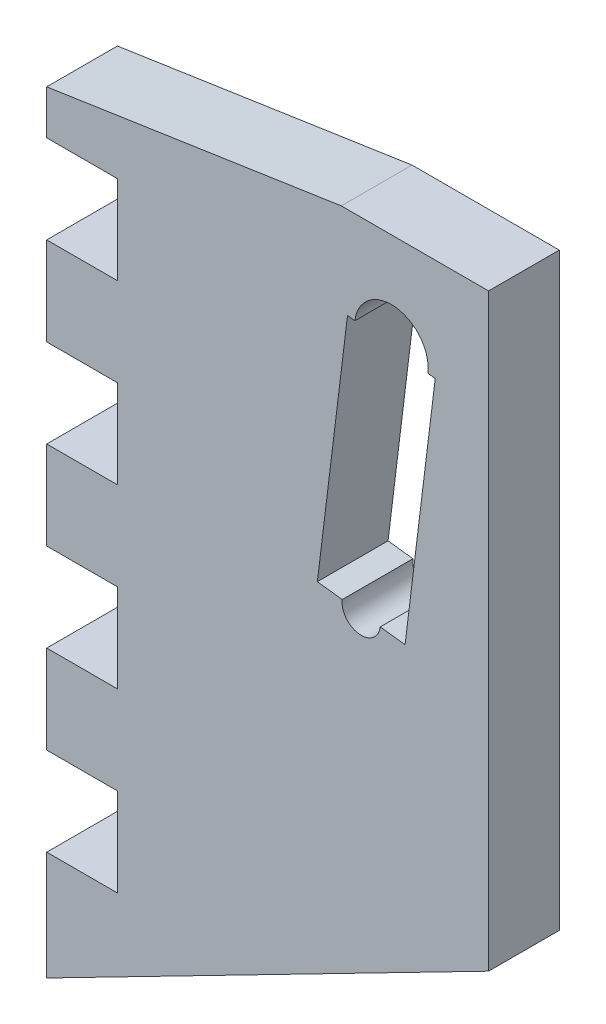
ISO-10303-21;
HEADER;
FILE_DESCRIPTION(('STEP AP214'),'2;1');
FILE_NAME('part.step','',(''),(''),'','','');
FILE_SCHEMA(('AUTOMOTIVE_DESIGN { 1 0 10303 214 1 1 1 1 }'));
ENDSEC;
DATA;
#1=APPLICATION_CONTEXT('core data for automotive mechanical design processes');
#2=APPLICATION_PROTOCOL_DEFINITION('international standard','automotive_design',2000,#1);
#3=PRODUCT_CONTEXT('',#1,'mechanical');
#4=PRODUCT('Part','Part','',(#3));
#5=PRODUCT_RELATED_PRODUCT_CATEGORY('part','',(#4));
#6=PRODUCT_DEFINITION_FORMATION('','',#4);
#7=PRODUCT_DEFINITION_CONTEXT('part definition',#1,'design');
#8=PRODUCT_DEFINITION('design','',#6,#7);
#9=PRODUCT_DEFINITION_SHAPE('','',#8);
#10=(LENGTH_UNIT() NAMED_UNIT(*) SI_UNIT(.MILLI.,.METRE.));
#11=(NAMED_UNIT(*) PLANE_ANGLE_UNIT() SI_UNIT($,.RADIAN.));
#12=(NAMED_UNIT(*) SI_UNIT($,.STERADIAN.) SOLID_ANGLE_UNIT());
#13=UNCERTAINTY_MEASURE_WITH_UNIT(LENGTH_MEASURE(1.E-05),#10,'distance_accuracy_value','');
#14=(GEOMETRIC_REPRESENTATION_CONTEXT(3) GLOBAL_UNCERTAINTY_ASSIGNED_CONTEXT((#13)) GLOBAL_UNIT_ASSIGNED_CONTEXT((#10,
#11,#12)) REPRESENTATION_CONTEXT('',''));
#15=CARTESIAN_POINT('',(0.,0.,0.));
#16=DIRECTION('',(0.,0.,1.));
#17=DIRECTION('',(1.,0.,0.));
#18=AXIS2_PLACEMENT_3D('',#15,#16,#17);
#19=CARTESIAN_POINT('',(-38.1,0.,6.096));
#20=DIRECTION('',(1.,0.,0.));
#21=DIRECTION('',(0.,0.,-1.));
#22=AXIS2_PLACEMENT_3D('',#19,#20,#21);
#23=PLANE('',#22);
#24=DIRECTION('',(0.,0.,1.));
#25=VECTOR('',#24,1.);
#26=CARTESIAN_POINT('',(-38.1,-60.96,0.));
#27=LINE('',#26,#25);
#28=CARTESIAN_POINT('',(-38.1,-60.96,0.));
#29=VERTEX_POINT('',#28);
#30=CARTESIAN_POINT('',(-38.1,-60.96,6.096));
#31=VERTEX_POINT('',#30);
#32=EDGE_CURVE('E296',#29,#31,#27,.T.);
#33=ORIENTED_EDGE('',*,*,#32,.F.);
#34=DIRECTION('',(0.,-1.,0.));
#35=VECTOR('',#34,1.);
#36=CARTESIAN_POINT('',(-38.1,0.,0.));
#37=LINE('',#36,#35);
#38=CARTESIAN_POINT('',(-38.1,-70.358,0.));
#39=VERTEX_POINT('',#38);
#40=EDGE_CURVE('E356',#29,#39,#37,.T.);
#41=ORIENTED_EDGE('',*,*,#40,.T.);
#42=DIRECTION('',(0.,0.,-1.));
#43=VECTOR('',#42,1.);
#44=CARTESIAN_POINT('',(-38.1,-70.358,6.096));
#45=LINE('',#44,#43);
#46=CARTESIAN_POINT('',(-38.1,-70.358,6.096));
#47=VERTEX_POINT('',#46);
#48=EDGE_CURVE('E431',#47,#39,#45,.T.);
#49=ORIENTED_EDGE('',*,*,#48,.F.);
#50=DIRECTION('',(0.,-1.,0.));
#51=VECTOR('',#50,1.);
#52=CARTESIAN_POINT('',(-38.1,0.,6.096));
#53=LINE('',#52,#51);
#54=EDGE_CURVE('E316',#31,#47,#53,.T.);
#55=ORIENTED_EDGE('',*,*,#54,.F.);
#56=EDGE_LOOP('',(#33,#41,#49,#55));
#57=FACE_BOUND('',#56,.T.);
#58=ADVANCED_FACE('F40',(#57),#23,.F.);
#59=DIRECTION('',(0.,0.,1.));
#60=VECTOR('',#59,1.);
#61=CARTESIAN_POINT('',(-38.1,-53.34,0.));
#62=LINE('',#61,#60);
#63=CARTESIAN_POINT('',(-38.1,-53.34,0.));
#64=VERTEX_POINT('',#63);
#65=CARTESIAN_POINT('',(-38.1,-53.34,6.096));
#66=VERTEX_POINT('',#65);
#67=EDGE_CURVE('E299',#64,#66,#62,.T.);
#68=ORIENTED_EDGE('',*,*,#67,.T.);
#69=CARTESIAN_POINT('',(-38.1,-45.72,6.096));
#70=VERTEX_POINT('',#69);
#71=EDGE_CURVE('E318',#70,#66,#53,.T.);
#72=ORIENTED_EDGE('',*,*,#71,.F.);
#73=DIRECTION('',(0.,0.,-1.));
#74=VECTOR('',#73,1.);
#75=CARTESIAN_POINT('',(-38.1,-45.72,6.096));
#76=LINE('',#75,#74);
#77=CARTESIAN_POINT('',(-38.1,-45.72,0.));
#78=VERTEX_POINT('',#77);
#79=EDGE_CURVE('E353',#70,#78,#76,.T.);
#80=ORIENTED_EDGE('',*,*,#79,.T.);
#81=EDGE_CURVE('E357',#78,#64,#37,.T.);
#82=ORIENTED_EDGE('',*,*,#81,.T.);
#83=EDGE_LOOP('',(#68,#72,#80,#82));
#84=FACE_BOUND('',#83,.T.);
#85=ADVANCED_FACE('F472',(#84),#23,.F.);
#86=CARTESIAN_POINT('',(0.,0.,6.096));
#87=DIRECTION('',(0.,0.,1.));
#88=DIRECTION('',(1.,0.,0.));
#89=AXIS2_PLACEMENT_3D('',#86,#87,#88);
#90=PLANE('',#89);
#91=DIRECTION('',(-0.992546151641322,0.121869343405147,0.));
#92=VECTOR('',#91,1.);
#93=CARTESIAN_POINT('',(-5.2306659685388,-8.76893516531134,6.096));
#94=LINE('',#93,#92);
#95=CARTESIAN_POINT('',(-4.60039916224656,-8.84632219837361,6.096));
#96=VERTEX_POINT('',#95);
#97=CARTESIAN_POINT('',(-5.2306659685388,-8.76893516531134,6.096));
#98=VERTEX_POINT('',#97);
#99=EDGE_CURVE('E241',#96,#98,#94,.T.);
#100=ORIENTED_EDGE('',*,*,#99,.F.);
#101=DIRECTION('',(0.121869343405148,0.992546151641322,0.));
#102=VECTOR('',#101,1.);
#103=CARTESIAN_POINT('',(-4.60039916224656,-8.84632219837361,6.096));
#104=LINE('',#103,#102);
#105=CARTESIAN_POINT('',(-7.2006034731388,-30.0232868897929,6.096));
#106=VERTEX_POINT('',#105);
#107=EDGE_CURVE('E242',#106,#96,#104,.T.);
#108=ORIENTED_EDGE('',*,*,#107,.F.);
#109=DIRECTION('',(0.992546151641322,-0.121869343405146,0.));
#110=VECTOR('',#109,1.);
#111=CARTESIAN_POINT('',(-9.34351061453241,-29.7601709773811,6.096));
#112=LINE('',#111,#110);
#113=CARTESIAN_POINT('',(-9.34351061453242,-29.7601709773811,6.096));
#114=VERTEX_POINT('',#113);
#115=EDGE_CURVE('E257',#114,#106,#112,.T.);
#116=ORIENTED_EDGE('',*,*,#115,.F.);
#117=CARTESIAN_POINT('',(-10.9822043108922,-29.5589646914192,6.096));
#118=DIRECTION('',(0.,0.,1.));
#119=DIRECTION('',(1.,0.,0.));
#120=AXIS2_PLACEMENT_3D('',#117,#118,#119);
#121=CIRCLE('',#120,1.651);
#122=CARTESIAN_POINT('',(-12.6208980072521,-29.3577584054573,6.096));
#123=VERTEX_POINT('',#122);
#124=EDGE_CURVE('E277',#114,#123,#121,.F.);
#125=ORIENTED_EDGE('',*,*,#124,.T.);
#126=CARTESIAN_POINT('',(-14.7638051486457,-29.0946424930456,6.096));
#127=VERTEX_POINT('',#126);
#128=EDGE_CURVE('E55',#127,#123,#112,.T.);
#129=ORIENTED_EDGE('',*,*,#128,.F.);
#130=DIRECTION('',(-0.121869343405148,-0.992546151641322,0.));
#131=VECTOR('',#130,1.);
#132=CARTESIAN_POINT('',(-12.1636008377534,-7.91767780162639,6.096));
#133=LINE('',#132,#131);
#134=CARTESIAN_POINT('',(-12.1636008377534,-7.91767780162639,6.096));
#135=VERTEX_POINT('',#134);
#136=EDGE_CURVE('E248',#135,#127,#133,.T.);
#137=ORIENTED_EDGE('',*,*,#136,.F.);
#138=CARTESIAN_POINT('',(-11.5333340314612,-7.99506483468866,6.096));
#139=VERTEX_POINT('',#138);
#140=EDGE_CURVE('E231',#139,#135,#94,.T.);
#141=ORIENTED_EDGE('',*,*,#140,.F.);
#142=CARTESIAN_POINT('',(-8.382,-8.382,6.096));
#143=DIRECTION('',(0.,0.,1.));
#144=DIRECTION('',(1.,0.,0.));
#145=AXIS2_PLACEMENT_3D('',#142,#143,#144);
#146=CIRCLE('',#145,3.175);
#147=EDGE_CURVE('E314',#98,#139,#146,.T.);
#148=ORIENTED_EDGE('',*,*,#147,.F.);
#149=EDGE_LOOP('',(#100,#108,#116,#125,#129,#137,#141,#148));
#150=FACE_BOUND('',#149,.T.);
#151=DIRECTION('',(0.,-1.,0.));
#152=VECTOR('',#151,1.);
#153=CARTESIAN_POINT('',(-32.004,0.,6.096));
#154=LINE('',#153,#152);
#155=CARTESIAN_POINT('',(-32.004,-53.34,6.096));
#156=VERTEX_POINT('',#155);
#157=CARTESIAN_POINT('',(-32.004,-60.96,6.096));
#158=VERTEX_POINT('',#157);
#159=EDGE_CURVE('E291',#156,#158,#154,.T.);
#160=ORIENTED_EDGE('',*,*,#159,.T.);
#161=DIRECTION('',(-1.,0.,0.));
#162=VECTOR('',#161,1.);
#163=CARTESIAN_POINT('',(0.,-60.96,6.096));
#164=LINE('',#163,#162);
#165=EDGE_CURVE('E279',#158,#31,#164,.T.);
#166=ORIENTED_EDGE('',*,*,#165,.T.);
#167=ORIENTED_EDGE('',*,*,#54,.T.);
#168=DIRECTION('',(0.889632145943001,0.456677834917407,0.));
#169=VECTOR('',#168,1.);
#170=CARTESIAN_POINT('',(20.6387843399346,-40.2054240388336,6.096));
#171=LINE('',#170,#169);
#172=CARTESIAN_POINT('',(0.,-50.8,6.096));
#173=VERTEX_POINT('',#172);
#174=EDGE_CURVE('E321',#47,#173,#171,.T.);
#175=ORIENTED_EDGE('',*,*,#174,.T.);
#176=DIRECTION('',(0.,-1.,0.));
#177=VECTOR('',#176,1.);
#178=CARTESIAN_POINT('',(0.,0.,6.096));
#179=LINE('',#178,#177);
#180=CARTESIAN_POINT('',(0.,0.,6.096));
#181=VERTEX_POINT('',#180);
#182=EDGE_CURVE('E323',#181,#173,#179,.T.);
#183=ORIENTED_EDGE('',*,*,#182,.F.);
#184=DIRECTION('',(-1.,0.,0.));
#185=VECTOR('',#184,1.);
#186=CARTESIAN_POINT('',(0.,0.,6.096));
#187=LINE('',#186,#185);
#188=CARTESIAN_POINT('',(-12.7,0.,6.096));
#189=VERTEX_POINT('',#188);
#190=EDGE_CURVE('E326',#181,#189,#187,.T.);
#191=ORIENTED_EDGE('',*,*,#190,.T.);
#192=DIRECTION('',(0.988936352868298,0.148340452930245,0.));
#193=VECTOR('',#192,1.);
#194=CARTESIAN_POINT('',(-0.279462102689486,1.86308068459657,6.096));
#195=LINE('',#194,#193);
#196=CARTESIAN_POINT('',(-38.1,-3.81,6.096));
#197=VERTEX_POINT('',#196);
#198=EDGE_CURVE('E310',#197,#189,#195,.T.);
#199=ORIENTED_EDGE('',*,*,#198,.F.);
#200=DIRECTION('',(0.,-1.,0.));
#201=VECTOR('',#200,1.);
#202=CARTESIAN_POINT('',(-38.1,0.,6.096));
#203=LINE('',#202,#201);
#204=CARTESIAN_POINT('',(-38.1,-7.62,6.096));
#205=VERTEX_POINT('',#204);
#206=EDGE_CURVE('E329',#197,#205,#203,.T.);
#207=ORIENTED_EDGE('',*,*,#206,.T.);
#208=DIRECTION('',(1.,0.,0.));
#209=VECTOR('',#208,1.);
#210=CARTESIAN_POINT('',(0.,-7.61999999999999,6.096));
#211=LINE('',#210,#209);
#212=CARTESIAN_POINT('',(-32.004,-7.62,6.096));
#213=VERTEX_POINT('',#212);
#214=EDGE_CURVE('E331',#205,#213,#211,.T.);
#215=ORIENTED_EDGE('',*,*,#214,.T.);
#216=DIRECTION('',(0.,-1.,0.));
#217=VECTOR('',#216,1.);
#218=CARTESIAN_POINT('',(-32.004,0.,6.096));
#219=LINE('',#218,#217);
#220=CARTESIAN_POINT('',(-32.004,-15.24,6.096));
#221=VERTEX_POINT('',#220);
#222=EDGE_CURVE('E333',#213,#221,#219,.T.);
#223=ORIENTED_EDGE('',*,*,#222,.T.);
#224=DIRECTION('',(-1.,0.,0.));
#225=VECTOR('',#224,1.);
#226=CARTESIAN_POINT('',(0.,-15.24,6.096));
#227=LINE('',#226,#225);
#228=CARTESIAN_POINT('',(-38.1,-15.24,6.096));
#229=VERTEX_POINT('',#228);
#230=EDGE_CURVE('E335',#221,#229,#227,.T.);
#231=ORIENTED_EDGE('',*,*,#230,.T.);
#232=DIRECTION('',(0.,-1.,0.));
#233=VECTOR('',#232,1.);
#234=CARTESIAN_POINT('',(-38.1,0.,6.096));
#235=LINE('',#234,#233);
#236=CARTESIAN_POINT('',(-38.1,-22.86,6.096));
#237=VERTEX_POINT('',#236);
#238=EDGE_CURVE('E337',#229,#237,#235,.T.);
#239=ORIENTED_EDGE('',*,*,#238,.T.);
#240=DIRECTION('',(1.,0.,0.));
#241=VECTOR('',#240,1.);
#242=CARTESIAN_POINT('',(0.,-22.86,6.096));
#243=LINE('',#242,#241);
#244=CARTESIAN_POINT('',(-32.004,-22.86,6.096));
#245=VERTEX_POINT('',#244);
#246=EDGE_CURVE('E339',#237,#245,#243,.T.);
#247=ORIENTED_EDGE('',*,*,#246,.T.);
#248=DIRECTION('',(0.,-1.,0.));
#249=VECTOR('',#248,1.);
#250=CARTESIAN_POINT('',(-32.004,0.,6.096));
#251=LINE('',#250,#249);
#252=CARTESIAN_POINT('',(-32.004,-30.48,6.096));
#253=VERTEX_POINT('',#252);
#254=EDGE_CURVE('E341',#245,#253,#251,.T.);
#255=ORIENTED_EDGE('',*,*,#254,.T.);
#256=DIRECTION('',(-1.,0.,0.));
#257=VECTOR('',#256,1.);
#258=CARTESIAN_POINT('',(0.,-30.48,6.096));
#259=LINE('',#258,#257);
#260=CARTESIAN_POINT('',(-38.1,-30.48,6.096));
#261=VERTEX_POINT('',#260);
#262=EDGE_CURVE('E343',#253,#261,#259,.T.);
#263=ORIENTED_EDGE('',*,*,#262,.T.);
#264=DIRECTION('',(0.,-1.,0.));
#265=VECTOR('',#264,1.);
#266=CARTESIAN_POINT('',(-38.1,0.,6.096));
#267=LINE('',#266,#265);
#268=CARTESIAN_POINT('',(-38.1,-38.1,6.096));
#269=VERTEX_POINT('',#268);
#270=EDGE_CURVE('E345',#261,#269,#267,.T.);
#271=ORIENTED_EDGE('',*,*,#270,.T.);
#272=DIRECTION('',(1.,0.,0.));
#273=VECTOR('',#272,1.);
#274=CARTESIAN_POINT('',(0.,-38.1,6.096));
#275=LINE('',#274,#273);
#276=CARTESIAN_POINT('',(-32.004,-38.1,6.096));
#277=VERTEX_POINT('',#276);
#278=EDGE_CURVE('E347',#269,#277,#275,.T.);
#279=ORIENTED_EDGE('',*,*,#278,.T.);
#280=DIRECTION('',(0.,-1.,0.));
#281=VECTOR('',#280,1.);
#282=CARTESIAN_POINT('',(-32.004,0.,6.096));
#283=LINE('',#282,#281);
#284=CARTESIAN_POINT('',(-32.004,-45.72,6.096));
#285=VERTEX_POINT('',#284);
#286=EDGE_CURVE('E349',#277,#285,#283,.T.);
#287=ORIENTED_EDGE('',*,*,#286,.T.);
#288=DIRECTION('',(-1.,0.,0.));
#289=VECTOR('',#288,1.);
#290=CARTESIAN_POINT('',(0.,-45.72,6.096));
#291=LINE('',#290,#289);
#292=EDGE_CURVE('E351',#285,#70,#291,.T.);
#293=ORIENTED_EDGE('',*,*,#292,.T.);
#294=ORIENTED_EDGE('',*,*,#71,.T.);
#295=DIRECTION('',(1.,0.,0.));
#296=VECTOR('',#295,1.);
#297=CARTESIAN_POINT('',(0.,-53.34,6.096));
#298=LINE('',#297,#296);
#299=EDGE_CURVE('E283',#66,#156,#298,.T.);
#300=ORIENTED_EDGE('',*,*,#299,.T.);
#301=EDGE_LOOP('',(#160,#166,#167,#175,#183,#191,#199,#207,#215,#223,#231,#239,#247,#255,#263,
#271,#279,#287,#293,#294,#300));
#302=FACE_BOUND('',#301,.T.);
#303=ADVANCED_FACE('F254',(#150,#302),#90,.T.);
#304=CARTESIAN_POINT('',(0.,0.,0.));
#305=DIRECTION('',(0.,0.,1.));
#306=DIRECTION('',(1.,0.,0.));
#307=AXIS2_PLACEMENT_3D('',#304,#305,#306);
#308=PLANE('',#307);
#309=DIRECTION('',(-0.121869343405148,-0.992546151641322,0.));
#310=VECTOR('',#309,1.);
#311=CARTESIAN_POINT('',(-4.60039916224656,-8.84632219837361,0.));
#312=LINE('',#311,#310);
#313=CARTESIAN_POINT('',(-4.60039916224656,-8.84632219837361,0.));
#314=VERTEX_POINT('',#313);
#315=CARTESIAN_POINT('',(-7.2006034731388,-30.0232868897929,0.));
#316=VERTEX_POINT('',#315);
#317=EDGE_CURVE('E449',#314,#316,#312,.T.);
#318=ORIENTED_EDGE('',*,*,#317,.F.);
#319=DIRECTION('',(0.992546151641322,-0.121869343405147,0.));
#320=VECTOR('',#319,1.);
#321=CARTESIAN_POINT('',(-5.2306659685388,-8.76893516531134,0.));
#322=LINE('',#321,#320);
#323=CARTESIAN_POINT('',(-5.2306659685388,-8.76893516531134,0.));
#324=VERTEX_POINT('',#323);
#325=EDGE_CURVE('E452',#324,#314,#322,.T.);
#326=ORIENTED_EDGE('',*,*,#325,.F.);
#327=CARTESIAN_POINT('',(-8.382,-8.382,0.));
#328=DIRECTION('',(0.,0.,1.));
#329=DIRECTION('',(1.,0.,0.));
#330=AXIS2_PLACEMENT_3D('',#327,#328,#329);
#331=CIRCLE('',#330,3.175);
#332=CARTESIAN_POINT('',(-11.5333340314612,-7.99506483468866,0.));
#333=VERTEX_POINT('',#332);
#334=EDGE_CURVE('E313',#324,#333,#331,.T.);
#335=ORIENTED_EDGE('',*,*,#334,.T.);
#336=CARTESIAN_POINT('',(-12.1636008377534,-7.91767780162639,0.));
#337=VERTEX_POINT('',#336);
#338=EDGE_CURVE('E261',#337,#333,#322,.T.);
#339=ORIENTED_EDGE('',*,*,#338,.F.);
#340=DIRECTION('',(0.121869343405148,0.992546151641322,0.));
#341=VECTOR('',#340,1.);
#342=CARTESIAN_POINT('',(-12.1636008377534,-7.91767780162639,0.));
#343=LINE('',#342,#341);
#344=CARTESIAN_POINT('',(-14.7638051486457,-29.0946424930456,0.));
#345=VERTEX_POINT('',#344);
#346=EDGE_CURVE('E250',#345,#337,#343,.T.);
#347=ORIENTED_EDGE('',*,*,#346,.F.);
#348=DIRECTION('',(-0.992546151641322,0.121869343405146,0.));
#349=VECTOR('',#348,1.);
#350=CARTESIAN_POINT('',(-9.34351061453241,-29.7601709773811,0.));
#351=LINE('',#350,#349);
#352=CARTESIAN_POINT('',(-12.6208980072521,-29.3577584054573,0.));
#353=VERTEX_POINT('',#352);
#354=EDGE_CURVE('E268',#353,#345,#351,.T.);
#355=ORIENTED_EDGE('',*,*,#354,.F.);
#356=CARTESIAN_POINT('',(-10.9822043108922,-29.5589646914192,0.));
#357=DIRECTION('',(0.,0.,-1.));
#358=DIRECTION('',(-1.,0.,0.));
#359=AXIS2_PLACEMENT_3D('',#356,#357,#358);
#360=CIRCLE('',#359,1.651);
#361=CARTESIAN_POINT('',(-9.34351061453242,-29.7601709773811,0.));
#362=VERTEX_POINT('',#361);
#363=EDGE_CURVE('E274',#362,#353,#360,.T.);
#364=ORIENTED_EDGE('',*,*,#363,.F.);
#365=EDGE_CURVE('E63',#316,#362,#351,.T.);
#366=ORIENTED_EDGE('',*,*,#365,.F.);
#367=EDGE_LOOP('',(#318,#326,#335,#339,#347,#355,#364,#366));
#368=FACE_BOUND('',#367,.T.);
#369=DIRECTION('',(-1.,0.,0.));
#370=VECTOR('',#369,1.);
#371=CARTESIAN_POINT('',(0.,-60.96,0.));
#372=LINE('',#371,#370);
#373=CARTESIAN_POINT('',(-32.004,-60.96,0.));
#374=VERTEX_POINT('',#373);
#375=EDGE_CURVE('E280',#374,#29,#372,.T.);
#376=ORIENTED_EDGE('',*,*,#375,.F.);
#377=DIRECTION('',(0.,-1.,0.));
#378=VECTOR('',#377,1.);
#379=CARTESIAN_POINT('',(-32.004,0.,0.));
#380=LINE('',#379,#378);
#381=CARTESIAN_POINT('',(-32.004,-53.34,0.));
#382=VERTEX_POINT('',#381);
#383=EDGE_CURVE('E282',#382,#374,#380,.T.);
#384=ORIENTED_EDGE('',*,*,#383,.F.);
#385=DIRECTION('',(1.,0.,0.));
#386=VECTOR('',#385,1.);
#387=CARTESIAN_POINT('',(0.,-53.34,0.));
#388=LINE('',#387,#386);
#389=EDGE_CURVE('E285',#64,#382,#388,.T.);
#390=ORIENTED_EDGE('',*,*,#389,.F.);
#391=ORIENTED_EDGE('',*,*,#81,.F.);
#392=DIRECTION('',(-1.,0.,0.));
#393=VECTOR('',#392,1.);
#394=CARTESIAN_POINT('',(0.,-45.72,0.));
#395=LINE('',#394,#393);
#396=CARTESIAN_POINT('',(-32.004,-45.72,0.));
#397=VERTEX_POINT('',#396);
#398=EDGE_CURVE('E317',#397,#78,#395,.T.);
#399=ORIENTED_EDGE('',*,*,#398,.F.);
#400=DIRECTION('',(0.,-1.,0.));
#401=VECTOR('',#400,1.);
#402=CARTESIAN_POINT('',(-32.004,0.,0.));
#403=LINE('',#402,#401);
#404=CARTESIAN_POINT('',(-32.004,-38.1,0.));
#405=VERTEX_POINT('',#404);
#406=EDGE_CURVE('E389',#405,#397,#403,.T.);
#407=ORIENTED_EDGE('',*,*,#406,.F.);
#408=DIRECTION('',(1.,0.,0.));
#409=VECTOR('',#408,1.);
#410=CARTESIAN_POINT('',(0.,-38.1,0.));
#411=LINE('',#410,#409);
#412=CARTESIAN_POINT('',(-38.1,-38.1,0.));
#413=VERTEX_POINT('',#412);
#414=EDGE_CURVE('E387',#413,#405,#411,.T.);
#415=ORIENTED_EDGE('',*,*,#414,.F.);
#416=DIRECTION('',(0.,-1.,0.));
#417=VECTOR('',#416,1.);
#418=CARTESIAN_POINT('',(-38.1,0.,0.));
#419=LINE('',#418,#417);
#420=CARTESIAN_POINT('',(-38.1,-30.48,0.));
#421=VERTEX_POINT('',#420);
#422=EDGE_CURVE('E385',#421,#413,#419,.T.);
#423=ORIENTED_EDGE('',*,*,#422,.F.);
#424=DIRECTION('',(-1.,0.,0.));
#425=VECTOR('',#424,1.);
#426=CARTESIAN_POINT('',(0.,-30.48,0.));
#427=LINE('',#426,#425);
#428=CARTESIAN_POINT('',(-32.004,-30.48,0.));
#429=VERTEX_POINT('',#428);
#430=EDGE_CURVE('E383',#429,#421,#427,.T.);
#431=ORIENTED_EDGE('',*,*,#430,.F.);
#432=DIRECTION('',(0.,-1.,0.));
#433=VECTOR('',#432,1.);
#434=CARTESIAN_POINT('',(-32.004,0.,0.));
#435=LINE('',#434,#433);
#436=CARTESIAN_POINT('',(-32.004,-22.86,0.));
#437=VERTEX_POINT('',#436);
#438=EDGE_CURVE('E381',#437,#429,#435,.T.);
#439=ORIENTED_EDGE('',*,*,#438,.F.);
#440=DIRECTION('',(1.,0.,0.));
#441=VECTOR('',#440,1.);
#442=CARTESIAN_POINT('',(0.,-22.86,0.));
#443=LINE('',#442,#441);
#444=CARTESIAN_POINT('',(-38.1,-22.86,0.));
#445=VERTEX_POINT('',#444);
#446=EDGE_CURVE('E379',#445,#437,#443,.T.);
#447=ORIENTED_EDGE('',*,*,#446,.F.);
#448=DIRECTION('',(0.,-1.,0.));
#449=VECTOR('',#448,1.);
#450=CARTESIAN_POINT('',(-38.1,0.,0.));
#451=LINE('',#450,#449);
#452=CARTESIAN_POINT('',(-38.1,-15.24,0.));
#453=VERTEX_POINT('',#452);
#454=EDGE_CURVE('E377',#453,#445,#451,.T.);
#455=ORIENTED_EDGE('',*,*,#454,.F.);
#456=DIRECTION('',(-1.,0.,0.));
#457=VECTOR('',#456,1.);
#458=CARTESIAN_POINT('',(0.,-15.24,0.));
#459=LINE('',#458,#457);
#460=CARTESIAN_POINT('',(-32.004,-15.24,0.));
#461=VERTEX_POINT('',#460);
#462=EDGE_CURVE('E375',#461,#453,#459,.T.);
#463=ORIENTED_EDGE('',*,*,#462,.F.);
#464=DIRECTION('',(0.,-1.,0.));
#465=VECTOR('',#464,1.);
#466=CARTESIAN_POINT('',(-32.004,0.,0.));
#467=LINE('',#466,#465);
#468=CARTESIAN_POINT('',(-32.004,-7.62,0.));
#469=VERTEX_POINT('',#468);
#470=EDGE_CURVE('E373',#469,#461,#467,.T.);
#471=ORIENTED_EDGE('',*,*,#470,.F.);
#472=DIRECTION('',(1.,0.,0.));
#473=VECTOR('',#472,1.);
#474=CARTESIAN_POINT('',(0.,-7.61999999999999,0.));
#475=LINE('',#474,#473);
#476=CARTESIAN_POINT('',(-38.1,-7.62,0.));
#477=VERTEX_POINT('',#476);
#478=EDGE_CURVE('E371',#477,#469,#475,.T.);
#479=ORIENTED_EDGE('',*,*,#478,.F.);
#480=DIRECTION('',(0.,-1.,0.));
#481=VECTOR('',#480,1.);
#482=CARTESIAN_POINT('',(-38.1,0.,0.));
#483=LINE('',#482,#481);
#484=CARTESIAN_POINT('',(-38.1,-3.81,0.));
#485=VERTEX_POINT('',#484);
#486=EDGE_CURVE('E369',#485,#477,#483,.T.);
#487=ORIENTED_EDGE('',*,*,#486,.F.);
#488=DIRECTION('',(-0.988936352868298,-0.148340452930245,0.));
#489=VECTOR('',#488,1.);
#490=CARTESIAN_POINT('',(-12.7,0.,0.));
#491=LINE('',#490,#489);
#492=CARTESIAN_POINT('',(-12.7,0.,0.));
#493=VERTEX_POINT('',#492);
#494=EDGE_CURVE('E298',#493,#485,#491,.T.);
#495=ORIENTED_EDGE('',*,*,#494,.F.);
#496=DIRECTION('',(-1.,0.,0.));
#497=VECTOR('',#496,1.);
#498=CARTESIAN_POINT('',(0.,0.,0.));
#499=LINE('',#498,#497);
#500=CARTESIAN_POINT('',(0.,0.,0.));
#501=VERTEX_POINT('',#500);
#502=EDGE_CURVE('E366',#501,#493,#499,.T.);
#503=ORIENTED_EDGE('',*,*,#502,.F.);
#504=DIRECTION('',(0.,-1.,0.));
#505=VECTOR('',#504,1.);
#506=CARTESIAN_POINT('',(0.,0.,0.));
#507=LINE('',#506,#505);
#508=CARTESIAN_POINT('',(0.,-50.8,0.));
#509=VERTEX_POINT('',#508);
#510=EDGE_CURVE('E363',#501,#509,#507,.T.);
#511=ORIENTED_EDGE('',*,*,#510,.T.);
#512=DIRECTION('',(0.889632145943001,0.456677834917407,0.));
#513=VECTOR('',#512,1.);
#514=CARTESIAN_POINT('',(20.6387843399346,-40.2054240388336,0.));
#515=LINE('',#514,#513);
#516=EDGE_CURVE('E360',#39,#509,#515,.T.);
#517=ORIENTED_EDGE('',*,*,#516,.F.);
#518=ORIENTED_EDGE('',*,*,#40,.F.);
#519=EDGE_LOOP('',(#376,#384,#390,#391,#399,#407,#415,#423,#431,#439,#447,#455,#463,#471,#479,
#487,#495,#503,#511,#517,#518));
#520=FACE_BOUND('',#519,.T.);
#521=ADVANCED_FACE('F455',(#368,#520),#308,.F.);
#522=CARTESIAN_POINT('',(20.6387843399346,-40.2054240388336,6.096));
#523=DIRECTION('',(-0.456677834917407,0.889632145943001,0.));
#524=DIRECTION('',(-0.889632145943001,-0.456677834917407,0.));
#525=AXIS2_PLACEMENT_3D('',#522,#523,#524);
#526=PLANE('',#525);
#527=ORIENTED_EDGE('',*,*,#516,.T.);
#528=DIRECTION('',(0.,0.,-1.));
#529=VECTOR('',#528,1.);
#530=CARTESIAN_POINT('',(0.,-50.8,6.096));
#531=LINE('',#530,#529);
#532=EDGE_CURVE('E429',#173,#509,#531,.T.);
#533=ORIENTED_EDGE('',*,*,#532,.F.);
#534=ORIENTED_EDGE('',*,*,#174,.F.);
#535=ORIENTED_EDGE('',*,*,#48,.T.);
#536=EDGE_LOOP('',(#527,#533,#534,#535));
#537=FACE_BOUND('',#536,.T.);
#538=ADVANCED_FACE('F480',(#537),#526,.F.);
#539=CARTESIAN_POINT('',(0.,0.,6.096));
#540=DIRECTION('',(1.,0.,0.));
#541=DIRECTION('',(0.,1.,0.));
#542=AXIS2_PLACEMENT_3D('',#539,#540,#541);
#543=PLANE('',#542);
#544=ORIENTED_EDGE('',*,*,#510,.F.);
#545=DIRECTION('',(0.,0.,-1.));
#546=VECTOR('',#545,1.);
#547=CARTESIAN_POINT('',(0.,0.,6.096));
#548=LINE('',#547,#546);
#549=EDGE_CURVE('E427',#181,#501,#548,.T.);
#550=ORIENTED_EDGE('',*,*,#549,.F.);
#551=ORIENTED_EDGE('',*,*,#182,.T.);
#552=ORIENTED_EDGE('',*,*,#532,.T.);
#553=EDGE_LOOP('',(#544,#550,#551,#552));
#554=FACE_BOUND('',#553,.T.);
#555=ADVANCED_FACE('F483',(#554),#543,.T.);
#556=CARTESIAN_POINT('',(0.,0.,6.096));
#557=DIRECTION('',(0.,-1.,0.));
#558=DIRECTION('',(0.,0.,-1.));
#559=AXIS2_PLACEMENT_3D('',#556,#557,#558);
#560=PLANE('',#559);
#561=ORIENTED_EDGE('',*,*,#502,.T.);
#562=DIRECTION('',(0.,0.,-1.));
#563=VECTOR('',#562,1.);
#564=CARTESIAN_POINT('',(-12.7,0.,8.636));
#565=LINE('',#564,#563);
#566=EDGE_CURVE('E306',#189,#493,#565,.T.);
#567=ORIENTED_EDGE('',*,*,#566,.F.);
#568=ORIENTED_EDGE('',*,*,#190,.F.);
#569=ORIENTED_EDGE('',*,*,#549,.T.);
#570=EDGE_LOOP('',(#561,#567,#568,#569));
#571=FACE_BOUND('',#570,.T.);
#572=ADVANCED_FACE('F487',(#571),#560,.F.);
#573=CARTESIAN_POINT('',(-38.1,0.,6.096));
#574=DIRECTION('',(1.,0.,0.));
#575=DIRECTION('',(0.,0.,-1.));
#576=AXIS2_PLACEMENT_3D('',#573,#574,#575);
#577=PLANE('',#576);
#578=ORIENTED_EDGE('',*,*,#206,.F.);
#579=DIRECTION('',(0.,0.,-1.));
#580=VECTOR('',#579,1.);
#581=CARTESIAN_POINT('',(-38.1,-3.81,8.636));
#582=LINE('',#581,#580);
#583=EDGE_CURVE('E307',#197,#485,#582,.T.);
#584=ORIENTED_EDGE('',*,*,#583,.T.);
#585=ORIENTED_EDGE('',*,*,#486,.T.);
#586=DIRECTION('',(0.,0.,-1.));
#587=VECTOR('',#586,1.);
#588=CARTESIAN_POINT('',(-38.1,-7.62,6.096));
#589=LINE('',#588,#587);
#590=EDGE_CURVE('E424',#205,#477,#589,.T.);
#591=ORIENTED_EDGE('',*,*,#590,.F.);
#592=EDGE_LOOP('',(#578,#584,#585,#591));
#593=FACE_BOUND('',#592,.T.);
#594=ADVANCED_FACE('F491',(#593),#577,.F.);
#595=CARTESIAN_POINT('',(0.,-7.61999999999999,6.096));
#596=DIRECTION('',(0.,1.,0.));
#597=DIRECTION('',(-1.,0.,0.));
#598=AXIS2_PLACEMENT_3D('',#595,#596,#597);
#599=PLANE('',#598);
#600=ORIENTED_EDGE('',*,*,#478,.T.);
#601=DIRECTION('',(0.,0.,-1.));
#602=VECTOR('',#601,1.);
#603=CARTESIAN_POINT('',(-32.004,-7.62,6.096));
#604=LINE('',#603,#602);
#605=EDGE_CURVE('E421',#213,#469,#604,.T.);
#606=ORIENTED_EDGE('',*,*,#605,.F.);
#607=ORIENTED_EDGE('',*,*,#214,.F.);
#608=ORIENTED_EDGE('',*,*,#590,.T.);
#609=EDGE_LOOP('',(#600,#606,#607,#608));
#610=FACE_BOUND('',#609,.T.);
#611=ADVANCED_FACE('F495',(#610),#599,.F.);
#612=CARTESIAN_POINT('',(-32.004,0.,6.096));
#613=DIRECTION('',(1.,0.,0.));
#614=DIRECTION('',(0.,0.,-1.));
#615=AXIS2_PLACEMENT_3D('',#612,#613,#614);
#616=PLANE('',#615);
#617=ORIENTED_EDGE('',*,*,#470,.T.);
#618=DIRECTION('',(0.,0.,-1.));
#619=VECTOR('',#618,1.);
#620=CARTESIAN_POINT('',(-32.004,-15.24,6.096));
#621=LINE('',#620,#619);
#622=EDGE_CURVE('E418',#221,#461,#621,.T.);
#623=ORIENTED_EDGE('',*,*,#622,.F.);
#624=ORIENTED_EDGE('',*,*,#222,.F.);
#625=ORIENTED_EDGE('',*,*,#605,.T.);
#626=EDGE_LOOP('',(#617,#623,#624,#625));
#627=FACE_BOUND('',#626,.T.);
#628=ADVANCED_FACE('F499',(#627),#616,.F.);
#629=CARTESIAN_POINT('',(0.,-15.24,6.096));
#630=DIRECTION('',(0.,-1.,0.));
#631=DIRECTION('',(1.,0.,0.));
#632=AXIS2_PLACEMENT_3D('',#629,#630,#631);
#633=PLANE('',#632);
#634=ORIENTED_EDGE('',*,*,#462,.T.);
#635=DIRECTION('',(0.,0.,-1.));
#636=VECTOR('',#635,1.);
#637=CARTESIAN_POINT('',(-38.1,-15.24,6.096));
#638=LINE('',#637,#636);
#639=EDGE_CURVE('E415',#229,#453,#638,.T.);
#640=ORIENTED_EDGE('',*,*,#639,.F.);
#641=ORIENTED_EDGE('',*,*,#230,.F.);
#642=ORIENTED_EDGE('',*,*,#622,.T.);
#643=EDGE_LOOP('',(#634,#640,#641,#642));
#644=FACE_BOUND('',#643,.T.);
#645=ADVANCED_FACE('F503',(#644),#633,.F.);
#646=CARTESIAN_POINT('',(-38.1,0.,6.096));
#647=DIRECTION('',(1.,0.,0.));
#648=DIRECTION('',(0.,0.,-1.));
#649=AXIS2_PLACEMENT_3D('',#646,#647,#648);
#650=PLANE('',#649);
#651=ORIENTED_EDGE('',*,*,#454,.T.);
#652=DIRECTION('',(0.,0.,-1.));
#653=VECTOR('',#652,1.);
#654=CARTESIAN_POINT('',(-38.1,-22.86,6.096));
#655=LINE('',#654,#653);
#656=EDGE_CURVE('E412',#237,#445,#655,.T.);
#657=ORIENTED_EDGE('',*,*,#656,.F.);
#658=ORIENTED_EDGE('',*,*,#238,.F.);
#659=ORIENTED_EDGE('',*,*,#639,.T.);
#660=EDGE_LOOP('',(#651,#657,#658,#659));
#661=FACE_BOUND('',#660,.T.);
#662=ADVANCED_FACE('F507',(#661),#650,.F.);
#663=CARTESIAN_POINT('',(0.,-22.86,6.096));
#664=DIRECTION('',(0.,1.,0.));
#665=DIRECTION('',(-1.,0.,0.));
#666=AXIS2_PLACEMENT_3D('',#663,#664,#665);
#667=PLANE('',#666);
#668=ORIENTED_EDGE('',*,*,#446,.T.);
#669=DIRECTION('',(0.,0.,-1.));
#670=VECTOR('',#669,1.);
#671=CARTESIAN_POINT('',(-32.004,-22.86,6.096));
#672=LINE('',#671,#670);
#673=EDGE_CURVE('E409',#245,#437,#672,.T.);
#674=ORIENTED_EDGE('',*,*,#673,.F.);
#675=ORIENTED_EDGE('',*,*,#246,.F.);
#676=ORIENTED_EDGE('',*,*,#656,.T.);
#677=EDGE_LOOP('',(#668,#674,#675,#676));
#678=FACE_BOUND('',#677,.T.);
#679=ADVANCED_FACE('F511',(#678),#667,.F.);
#680=CARTESIAN_POINT('',(-32.004,0.,6.096));
#681=DIRECTION('',(1.,0.,0.));
#682=DIRECTION('',(0.,0.,-1.));
#683=AXIS2_PLACEMENT_3D('',#680,#681,#682);
#684=PLANE('',#683);
#685=ORIENTED_EDGE('',*,*,#438,.T.);
#686=DIRECTION('',(0.,0.,-1.));
#687=VECTOR('',#686,1.);
#688=CARTESIAN_POINT('',(-32.004,-30.48,6.096));
#689=LINE('',#688,#687);
#690=EDGE_CURVE('E406',#253,#429,#689,.T.);
#691=ORIENTED_EDGE('',*,*,#690,.F.);
#692=ORIENTED_EDGE('',*,*,#254,.F.);
#693=ORIENTED_EDGE('',*,*,#673,.T.);
#694=EDGE_LOOP('',(#685,#691,#692,#693));
#695=FACE_BOUND('',#694,.T.);
#696=ADVANCED_FACE('F515',(#695),#684,.F.);
#697=CARTESIAN_POINT('',(0.,-30.48,6.096));
#698=DIRECTION('',(0.,-1.,0.));
#699=DIRECTION('',(0.,0.,-1.));
#700=AXIS2_PLACEMENT_3D('',#697,#698,#699);
#701=PLANE('',#700);
#702=ORIENTED_EDGE('',*,*,#430,.T.);
#703=DIRECTION('',(0.,0.,-1.));
#704=VECTOR('',#703,1.);
#705=CARTESIAN_POINT('',(-38.1,-30.48,6.096));
#706=LINE('',#705,#704);
#707=EDGE_CURVE('E403',#261,#421,#706,.T.);
#708=ORIENTED_EDGE('',*,*,#707,.F.);
#709=ORIENTED_EDGE('',*,*,#262,.F.);
#710=ORIENTED_EDGE('',*,*,#690,.T.);
#711=EDGE_LOOP('',(#702,#708,#709,#710));
#712=FACE_BOUND('',#711,.T.);
#713=ADVANCED_FACE('F519',(#712),#701,.F.);
#714=CARTESIAN_POINT('',(-38.1,0.,6.096));
#715=DIRECTION('',(1.,0.,0.));
#716=DIRECTION('',(0.,0.,-1.));
#717=AXIS2_PLACEMENT_3D('',#714,#715,#716);
#718=PLANE('',#717);
#719=ORIENTED_EDGE('',*,*,#422,.T.);
#720=DIRECTION('',(0.,0.,-1.));
#721=VECTOR('',#720,1.);
#722=CARTESIAN_POINT('',(-38.1,-38.1,6.096));
#723=LINE('',#722,#721);
#724=EDGE_CURVE('E400',#269,#413,#723,.T.);
#725=ORIENTED_EDGE('',*,*,#724,.F.);
#726=ORIENTED_EDGE('',*,*,#270,.F.);
#727=ORIENTED_EDGE('',*,*,#707,.T.);
#728=EDGE_LOOP('',(#719,#725,#726,#727));
#729=FACE_BOUND('',#728,.T.);
#730=ADVANCED_FACE('F523',(#729),#718,.F.);
#731=CARTESIAN_POINT('',(0.,-38.1,6.096));
#732=DIRECTION('',(0.,1.,0.));
#733=DIRECTION('',(-1.,0.,0.));
#734=AXIS2_PLACEMENT_3D('',#731,#732,#733);
#735=PLANE('',#734);
#736=ORIENTED_EDGE('',*,*,#414,.T.);
#737=DIRECTION('',(0.,0.,-1.));
#738=VECTOR('',#737,1.);
#739=CARTESIAN_POINT('',(-32.004,-38.1,6.096));
#740=LINE('',#739,#738);
#741=EDGE_CURVE('E397',#277,#405,#740,.T.);
#742=ORIENTED_EDGE('',*,*,#741,.F.);
#743=ORIENTED_EDGE('',*,*,#278,.F.);
#744=ORIENTED_EDGE('',*,*,#724,.T.);
#745=EDGE_LOOP('',(#736,#742,#743,#744));
#746=FACE_BOUND('',#745,.T.);
#747=ADVANCED_FACE('F527',(#746),#735,.F.);
#748=CARTESIAN_POINT('',(-32.004,0.,6.096));
#749=DIRECTION('',(1.,0.,0.));
#750=DIRECTION('',(0.,0.,-1.));
#751=AXIS2_PLACEMENT_3D('',#748,#749,#750);
#752=PLANE('',#751);
#753=ORIENTED_EDGE('',*,*,#406,.T.);
#754=DIRECTION('',(0.,0.,-1.));
#755=VECTOR('',#754,1.);
#756=CARTESIAN_POINT('',(-32.004,-45.72,6.096));
#757=LINE('',#756,#755);
#758=EDGE_CURVE('E394',#285,#397,#757,.T.);
#759=ORIENTED_EDGE('',*,*,#758,.F.);
#760=ORIENTED_EDGE('',*,*,#286,.F.);
#761=ORIENTED_EDGE('',*,*,#741,.T.);
#762=EDGE_LOOP('',(#753,#759,#760,#761));
#763=FACE_BOUND('',#762,.T.);
#764=ADVANCED_FACE('F531',(#763),#752,.F.);
#765=CARTESIAN_POINT('',(-8.382,-8.382,6.096));
#766=DIRECTION('',(0.,0.,-1.));
#767=DIRECTION('',(-1.,0.,0.));
#768=AXIS2_PLACEMENT_3D('',#765,#766,#767);
#769=CYLINDRICAL_SURFACE('',#768,3.175);
#770=DIRECTION('',(0.,0.,-1.));
#771=VECTOR('',#770,1.);
#772=CARTESIAN_POINT('',(-5.2306659685388,-8.76893516531134,6.096));
#773=LINE('',#772,#771);
#774=EDGE_CURVE('E11',#98,#324,#773,.T.);
#775=ORIENTED_EDGE('',*,*,#774,.F.);
#776=ORIENTED_EDGE('',*,*,#147,.T.);
#777=DIRECTION('',(0.,0.,-1.));
#778=VECTOR('',#777,1.);
#779=CARTESIAN_POINT('',(-11.5333340314612,-7.99506483468866,6.096));
#780=LINE('',#779,#778);
#781=EDGE_CURVE('E48',#333,#139,#780,.F.);
#782=ORIENTED_EDGE('',*,*,#781,.F.);
#783=ORIENTED_EDGE('',*,*,#334,.F.);
#784=EDGE_LOOP('',(#775,#776,#782,#783));
#785=FACE_BOUND('',#784,.T.);
#786=ADVANCED_FACE('F42',(#785),#769,.F.);
#787=CARTESIAN_POINT('',(0.,-45.72,6.096));
#788=DIRECTION('',(0.,-1.,0.));
#789=DIRECTION('',(0.,0.,-1.));
#790=AXIS2_PLACEMENT_3D('',#787,#788,#789);
#791=PLANE('',#790);
#792=ORIENTED_EDGE('',*,*,#398,.T.);
#793=ORIENTED_EDGE('',*,*,#79,.F.);
#794=ORIENTED_EDGE('',*,*,#292,.F.);
#795=ORIENTED_EDGE('',*,*,#758,.T.);
#796=EDGE_LOOP('',(#792,#793,#794,#795));
#797=FACE_BOUND('',#796,.T.);
#798=ADVANCED_FACE('F536',(#797),#791,.F.);
#799=CARTESIAN_POINT('',(-12.7,0.,8.636));
#800=DIRECTION('',(0.148340452930245,-0.988936352868297,0.));
#801=DIRECTION('',(0.988936352868298,0.148340452930245,0.));
#802=AXIS2_PLACEMENT_3D('',#799,#800,#801);
#803=PLANE('',#802);
#804=ORIENTED_EDGE('',*,*,#198,.T.);
#805=ORIENTED_EDGE('',*,*,#566,.T.);
#806=ORIENTED_EDGE('',*,*,#494,.T.);
#807=ORIENTED_EDGE('',*,*,#583,.F.);
#808=EDGE_LOOP('',(#804,#805,#806,#807));
#809=FACE_BOUND('',#808,.T.);
#810=ADVANCED_FACE('F539',(#809),#803,.F.);
#811=CARTESIAN_POINT('',(0.,-60.96,0.));
#812=DIRECTION('',(0.,1.,0.));
#813=DIRECTION('',(0.,0.,1.));
#814=AXIS2_PLACEMENT_3D('',#811,#812,#813);
#815=PLANE('',#814);
#816=ORIENTED_EDGE('',*,*,#165,.F.);
#817=DIRECTION('',(0.,0.,1.));
#818=VECTOR('',#817,1.);
#819=CARTESIAN_POINT('',(-32.004,-60.96,0.));
#820=LINE('',#819,#818);
#821=EDGE_CURVE('E288',#374,#158,#820,.T.);
#822=ORIENTED_EDGE('',*,*,#821,.F.);
#823=ORIENTED_EDGE('',*,*,#375,.T.);
#824=ORIENTED_EDGE('',*,*,#32,.T.);
#825=EDGE_LOOP('',(#816,#822,#823,#824));
#826=FACE_BOUND('',#825,.T.);
#827=ADVANCED_FACE('F547',(#826),#815,.T.);
#828=CARTESIAN_POINT('',(0.,-53.34,0.));
#829=DIRECTION('',(0.,-1.,0.));
#830=DIRECTION('',(0.,0.,-1.));
#831=AXIS2_PLACEMENT_3D('',#828,#829,#830);
#832=PLANE('',#831);
#833=ORIENTED_EDGE('',*,*,#299,.F.);
#834=ORIENTED_EDGE('',*,*,#67,.F.);
#835=ORIENTED_EDGE('',*,*,#389,.T.);
#836=DIRECTION('',(0.,0.,1.));
#837=VECTOR('',#836,1.);
#838=CARTESIAN_POINT('',(-32.004,-53.34,0.));
#839=LINE('',#838,#837);
#840=EDGE_CURVE('E302',#382,#156,#839,.T.);
#841=ORIENTED_EDGE('',*,*,#840,.T.);
#842=EDGE_LOOP('',(#833,#834,#835,#841));
#843=FACE_BOUND('',#842,.T.);
#844=ADVANCED_FACE('F551',(#843),#832,.T.);
#845=CARTESIAN_POINT('',(-32.004,0.,0.));
#846=DIRECTION('',(-1.,0.,0.));
#847=DIRECTION('',(0.,0.,1.));
#848=AXIS2_PLACEMENT_3D('',#845,#846,#847);
#849=PLANE('',#848);
#850=ORIENTED_EDGE('',*,*,#159,.F.);
#851=ORIENTED_EDGE('',*,*,#840,.F.);
#852=ORIENTED_EDGE('',*,*,#383,.T.);
#853=ORIENTED_EDGE('',*,*,#821,.T.);
#854=EDGE_LOOP('',(#850,#851,#852,#853));
#855=FACE_BOUND('',#854,.T.);
#856=ADVANCED_FACE('F553',(#855),#849,.T.);
#857=CARTESIAN_POINT('',(-10.9822043108922,-29.5589646914192,10.765733182956));
#858=DIRECTION('',(0.,0.,-1.));
#859=DIRECTION('',(-1.,0.,0.));
#860=AXIS2_PLACEMENT_3D('',#857,#858,#859);
#861=CYLINDRICAL_SURFACE('',#860,1.651);
#862=ORIENTED_EDGE('',*,*,#363,.T.);
#863=DIRECTION('',(0.,0.,-1.));
#864=VECTOR('',#863,1.);
#865=CARTESIAN_POINT('',(-12.6208980072521,-29.3577584054573,10.765733182956));
#866=LINE('',#865,#864);
#867=EDGE_CURVE('E436',#353,#123,#866,.F.);
#868=ORIENTED_EDGE('',*,*,#867,.T.);
#869=ORIENTED_EDGE('',*,*,#124,.F.);
#870=DIRECTION('',(0.,0.,-1.));
#871=VECTOR('',#870,1.);
#872=CARTESIAN_POINT('',(-9.34351061453242,-29.7601709773811,10.765733182956));
#873=LINE('',#872,#871);
#874=EDGE_CURVE('E434',#114,#362,#873,.T.);
#875=ORIENTED_EDGE('',*,*,#874,.T.);
#876=EDGE_LOOP('',(#862,#868,#869,#875));
#877=FACE_BOUND('',#876,.T.);
#878=ADVANCED_FACE('F439',(#877),#861,.F.);
#879=CARTESIAN_POINT('',(-9.34351061453241,-29.7601709773811,-24.3300796218015));
#880=DIRECTION('',(-0.121869343405146,-0.992546151641322,0.));
#881=DIRECTION('',(0.992546151641322,-0.121869343405146,0.));
#882=AXIS2_PLACEMENT_3D('',#879,#880,#881);
#883=PLANE('',#882);
#884=ORIENTED_EDGE('',*,*,#115,.T.);
#885=DIRECTION('',(0.,0.,1.));
#886=VECTOR('',#885,1.);
#887=CARTESIAN_POINT('',(-7.2006034731388,-30.0232868897929,-24.3300796218015));
#888=LINE('',#887,#886);
#889=EDGE_CURVE('E269',#316,#106,#888,.T.);
#890=ORIENTED_EDGE('',*,*,#889,.F.);
#891=ORIENTED_EDGE('',*,*,#365,.T.);
#892=ORIENTED_EDGE('',*,*,#874,.F.);
#893=EDGE_LOOP('',(#884,#890,#891,#892));
#894=FACE_BOUND('',#893,.T.);
#895=ADVANCED_FACE('F444',(#894),#883,.F.);
#896=CARTESIAN_POINT('',(-5.2306659685388,-8.76893516531134,-24.3300796218015));
#897=DIRECTION('',(0.121869343405147,0.992546151641322,0.));
#898=DIRECTION('',(-0.992546151641322,0.121869343405147,0.));
#899=AXIS2_PLACEMENT_3D('',#896,#897,#898);
#900=PLANE('',#899);
#901=ORIENTED_EDGE('',*,*,#774,.T.);
#902=ORIENTED_EDGE('',*,*,#325,.T.);
#903=DIRECTION('',(0.,0.,1.));
#904=VECTOR('',#903,1.);
#905=CARTESIAN_POINT('',(-4.60039916224656,-8.84632219837361,-24.3300796218015));
#906=LINE('',#905,#904);
#907=EDGE_CURVE('E266',#314,#96,#906,.T.);
#908=ORIENTED_EDGE('',*,*,#907,.T.);
#909=ORIENTED_EDGE('',*,*,#99,.T.);
#910=EDGE_LOOP('',(#901,#902,#908,#909));
#911=FACE_BOUND('',#910,.T.);
#912=ADVANCED_FACE('F461',(#911),#900,.F.);
#913=CARTESIAN_POINT('',(-4.60039916224656,-8.84632219837361,-24.3300796218015));
#914=DIRECTION('',(0.992546151641322,-0.121869343405148,0.));
#915=DIRECTION('',(0.121869343405148,0.992546151641322,0.));
#916=AXIS2_PLACEMENT_3D('',#913,#914,#915);
#917=PLANE('',#916);
#918=ORIENTED_EDGE('',*,*,#317,.T.);
#919=ORIENTED_EDGE('',*,*,#889,.T.);
#920=ORIENTED_EDGE('',*,*,#107,.T.);
#921=ORIENTED_EDGE('',*,*,#907,.F.);
#922=EDGE_LOOP('',(#918,#919,#920,#921));
#923=FACE_BOUND('',#922,.T.);
#924=ADVANCED_FACE('F446',(#923),#917,.F.);
#925=ORIENTED_EDGE('',*,*,#354,.T.);
#926=DIRECTION('',(0.,0.,1.));
#927=VECTOR('',#926,1.);
#928=CARTESIAN_POINT('',(-14.7638051486457,-29.0946424930456,-24.3300796218015));
#929=LINE('',#928,#927);
#930=EDGE_CURVE('E251',#345,#127,#929,.T.);
#931=ORIENTED_EDGE('',*,*,#930,.T.);
#932=ORIENTED_EDGE('',*,*,#128,.T.);
#933=ORIENTED_EDGE('',*,*,#867,.F.);
#934=EDGE_LOOP('',(#925,#931,#932,#933));
#935=FACE_BOUND('',#934,.T.);
#936=ADVANCED_FACE('F454',(#935),#883,.F.);
#937=ORIENTED_EDGE('',*,*,#781,.T.);
#938=ORIENTED_EDGE('',*,*,#140,.T.);
#939=DIRECTION('',(0.,0.,1.));
#940=VECTOR('',#939,1.);
#941=CARTESIAN_POINT('',(-12.1636008377534,-7.91767780162639,-24.3300796218015));
#942=LINE('',#941,#940);
#943=EDGE_CURVE('E234',#337,#135,#942,.T.);
#944=ORIENTED_EDGE('',*,*,#943,.F.);
#945=ORIENTED_EDGE('',*,*,#338,.T.);
#946=EDGE_LOOP('',(#937,#938,#944,#945));
#947=FACE_BOUND('',#946,.T.);
#948=ADVANCED_FACE('F233',(#947),#900,.F.);
#949=CARTESIAN_POINT('',(-12.1636008377534,-7.91767780162639,-24.3300796218015));
#950=DIRECTION('',(-0.992546151641322,0.121869343405148,0.));
#951=DIRECTION('',(-0.121869343405148,-0.992546151641322,0.));
#952=AXIS2_PLACEMENT_3D('',#949,#950,#951);
#953=PLANE('',#952);
#954=ORIENTED_EDGE('',*,*,#346,.T.);
#955=ORIENTED_EDGE('',*,*,#943,.T.);
#956=ORIENTED_EDGE('',*,*,#136,.T.);
#957=ORIENTED_EDGE('',*,*,#930,.F.);
#958=EDGE_LOOP('',(#954,#955,#956,#957));
#959=FACE_BOUND('',#958,.T.);
#960=ADVANCED_FACE('F246',(#959),#953,.F.);
#961=CLOSED_SHELL('',(#58,#85,#303,#521,#538,#555,#572,#594,#611,#628,#645,#662,#679,#696,#713,
#730,#747,#764,#786,#798,#810,#827,#844,#856,#878,#895,#912,#924,#936,#948,#960));
#962=MANIFOLD_SOLID_BREP('B2',#961);
#963=ADVANCED_BREP_SHAPE_REPRESENTATION('',(#18,#962),#14);
#964=SHAPE_DEFINITION_REPRESENTATION(#9,#963);
ENDSEC;
END-ISO-10303-21;
